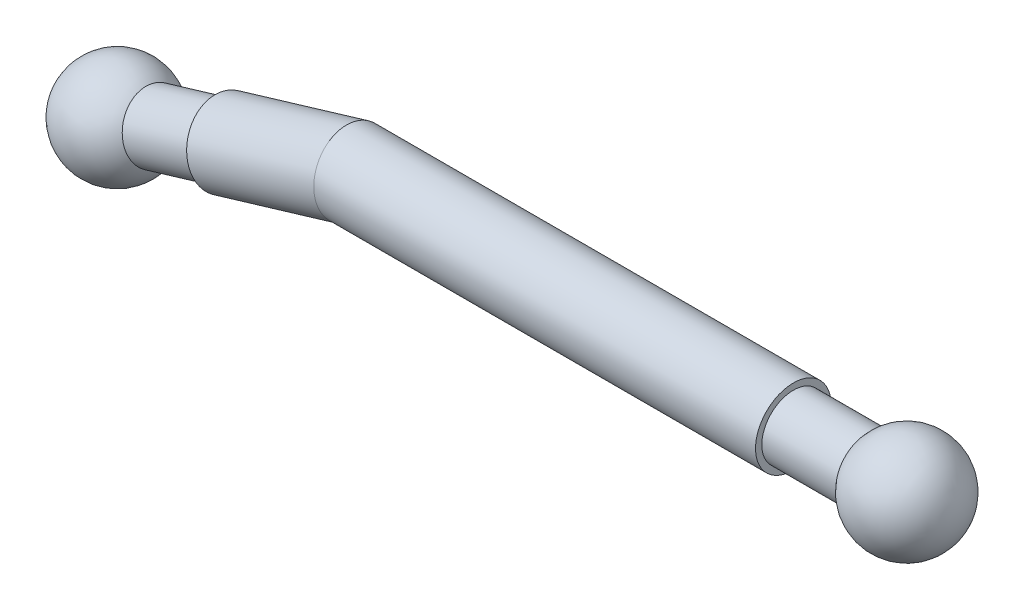
ISO-10303-21;
HEADER;
FILE_DESCRIPTION(('STEP AP214'),'2;1');
FILE_NAME('part.step','',(''),(''),'','','');
FILE_SCHEMA(('AUTOMOTIVE_DESIGN { 1 0 10303 214 1 1 1 1 }'));
ENDSEC;
DATA;
#1=APPLICATION_CONTEXT('core data for automotive mechanical design processes');
#2=APPLICATION_PROTOCOL_DEFINITION('international standard','automotive_design',2000,#1);
#3=PRODUCT_CONTEXT('',#1,'mechanical');
#4=PRODUCT('Part','Part','',(#3));
#5=PRODUCT_RELATED_PRODUCT_CATEGORY('part','',(#4));
#6=PRODUCT_DEFINITION_FORMATION('','',#4);
#7=PRODUCT_DEFINITION_CONTEXT('part definition',#1,'design');
#8=PRODUCT_DEFINITION('design','',#6,#7);
#9=PRODUCT_DEFINITION_SHAPE('','',#8);
#10=(LENGTH_UNIT() NAMED_UNIT(*) SI_UNIT(.MILLI.,.METRE.));
#11=(NAMED_UNIT(*) PLANE_ANGLE_UNIT() SI_UNIT($,.RADIAN.));
#12=(NAMED_UNIT(*) SI_UNIT($,.STERADIAN.) SOLID_ANGLE_UNIT());
#13=UNCERTAINTY_MEASURE_WITH_UNIT(LENGTH_MEASURE(1.E-05),#10,'distance_accuracy_value','');
#14=(GEOMETRIC_REPRESENTATION_CONTEXT(3) GLOBAL_UNCERTAINTY_ASSIGNED_CONTEXT((#13)) GLOBAL_UNIT_ASSIGNED_CONTEXT((#10,
#11,#12)) REPRESENTATION_CONTEXT('',''));
#15=CARTESIAN_POINT('',(0.,0.,0.));
#16=DIRECTION('',(0.,0.,1.));
#17=DIRECTION('',(1.,0.,0.));
#18=AXIS2_PLACEMENT_3D('',#15,#16,#17);
#19=CARTESIAN_POINT('',(6.,0.,0.));
#20=DIRECTION('',(-1.,0.,0.));
#21=DIRECTION('',(0.,0.,1.));
#22=AXIS2_PLACEMENT_3D('',#19,#20,#21);
#23=CYLINDRICAL_SURFACE('',#22,2.5);
#24=CARTESIAN_POINT('',(0.,0.,0.));
#25=DIRECTION('',(1.,0.,0.));
#26=DIRECTION('',(0.,0.,-1.));
#27=AXIS2_PLACEMENT_3D('',#24,#25,#26);
#28=CIRCLE('',#27,2.5);
#29=CARTESIAN_POINT('',(0.,0.,-2.5));
#30=VERTEX_POINT('',#29);
#31=EDGE_CURVE('E41',#30,#30,#28,.T.);
#32=ORIENTED_EDGE('',*,*,#31,.T.);
#33=EDGE_LOOP('',(#32));
#34=FACE_BOUND('',#33,.T.);
#35=CARTESIAN_POINT('',(5.8775010008008,0.,0.));
#36=DIRECTION('',(1.,0.,0.));
#37=DIRECTION('',(0.,0.,-1.));
#38=AXIS2_PLACEMENT_3D('',#35,#36,#37);
#39=CIRCLE('',#38,2.5);
#40=CARTESIAN_POINT('',(5.8775010008008,0.,-2.5));
#41=VERTEX_POINT('',#40);
#42=EDGE_CURVE('E11',#41,#41,#39,.T.);
#43=ORIENTED_EDGE('',*,*,#42,.F.);
#44=EDGE_LOOP('',(#43));
#45=FACE_BOUND('',#44,.T.);
#46=ADVANCED_FACE('F33',(#34,#45),#23,.T.);
#47=CARTESIAN_POINT('',(-50.7469577113269,-4.72408731339807,0.));
#48=DIRECTION('',(0.957826285221151,0.287347885566345,0.));
#49=DIRECTION('',(-0.287347885566345,0.957826285221152,0.));
#50=AXIS2_PLACEMENT_3D('',#47,#48,#49);
#51=CYLINDRICAL_SURFACE('',#50,2.5);
#52=CARTESIAN_POINT('',(-45.,-3.,0.));
#53=DIRECTION('',(-0.957826285221152,-0.287347885566345,0.));
#54=DIRECTION('',(0.287347885566345,-0.957826285221152,0.));
#55=AXIS2_PLACEMENT_3D('',#52,#53,#54);
#56=CIRCLE('',#55,2.5);
#57=CARTESIAN_POINT('',(-44.2816302860841,-5.39456571305288,0.));
#58=VERTEX_POINT('',#57);
#59=EDGE_CURVE('E59',#58,#58,#56,.T.);
#60=ORIENTED_EDGE('',*,*,#59,.T.);
#61=EDGE_LOOP('',(#60));
#62=FACE_BOUND('',#61,.T.);
#63=CARTESIAN_POINT('',(-50.6296249499807,-4.6888874849942,0.));
#64=DIRECTION('',(-0.957826285221151,-0.287347885566345,0.));
#65=DIRECTION('',(0.287347885566345,-0.957826285221152,0.));
#66=AXIS2_PLACEMENT_3D('',#63,#64,#65);
#67=CIRCLE('',#66,2.5);
#68=CARTESIAN_POINT('',(-49.9112552360648,-7.08345319804708,0.));
#69=VERTEX_POINT('',#68);
#70=EDGE_CURVE('E62',#69,#69,#67,.T.);
#71=ORIENTED_EDGE('',*,*,#70,.F.);
#72=EDGE_LOOP('',(#71));
#73=FACE_BOUND('',#72,.T.);
#74=ADVANCED_FACE('F84',(#62,#73),#51,.T.);
#75=CARTESIAN_POINT('',(-45.,-3.,0.));
#76=DIRECTION('',(0.957826285221151,0.287347885566345,0.));
#77=DIRECTION('',(0.,0.,-1.));
#78=AXIS2_PLACEMENT_3D('',#75,#76,#77);
#79=PLANE('',#78);
#80=ORIENTED_EDGE('',*,*,#59,.F.);
#81=EDGE_LOOP('',(#80));
#82=FACE_BOUND('',#81,.T.);
#83=CARTESIAN_POINT('',(-45.,-3.,0.));
#84=DIRECTION('',(0.957826285221151,0.287347885566345,0.));
#85=DIRECTION('',(0.,0.,-1.));
#86=AXIS2_PLACEMENT_3D('',#83,#84,#85);
#87=CIRCLE('',#86,3.);
#88=CARTESIAN_POINT('',(-45.,-3.,-3.));
#89=VERTEX_POINT('',#88);
#90=EDGE_CURVE('E46',#89,#89,#87,.T.);
#91=ORIENTED_EDGE('',*,*,#90,.F.);
#92=EDGE_LOOP('',(#91));
#93=FACE_BOUND('',#92,.T.);
#94=ADVANCED_FACE('F35',(#82,#93),#79,.F.);
#95=CARTESIAN_POINT('',(0.,0.,0.));
#96=DIRECTION('',(1.,0.,0.));
#97=DIRECTION('',(0.,0.,-1.));
#98=AXIS2_PLACEMENT_3D('',#95,#96,#97);
#99=PLANE('',#98);
#100=ORIENTED_EDGE('',*,*,#31,.F.);
#101=EDGE_LOOP('',(#100));
#102=FACE_BOUND('',#101,.T.);
#103=CARTESIAN_POINT('',(0.,0.,0.));
#104=DIRECTION('',(1.,0.,0.));
#105=DIRECTION('',(0.,0.,-1.));
#106=AXIS2_PLACEMENT_3D('',#103,#104,#105);
#107=CIRCLE('',#106,3.);
#108=CARTESIAN_POINT('',(0.,0.,-3.));
#109=VERTEX_POINT('',#108);
#110=EDGE_CURVE('E51',#109,#109,#107,.T.);
#111=ORIENTED_EDGE('',*,*,#110,.T.);
#112=EDGE_LOOP('',(#111));
#113=FACE_BOUND('',#112,.T.);
#114=ADVANCED_FACE('F75',(#102,#113),#99,.T.);
#115=CARTESIAN_POINT('',(-33.9763956463432,0.307081306097031,0.));
#116=DIRECTION('',(-0.957826285221151,-0.287347885566345,0.));
#117=DIRECTION('',(0.287347885566345,-0.957826285221151,0.));
#118=AXIS2_PLACEMENT_3D('',#115,#116,#117);
#119=CYLINDRICAL_SURFACE('',#118,3.);
#120=CARTESIAN_POINT('',(-35.,0.,0.));
#121=DIRECTION('',(-0.989400395497483,-0.145213144685405,0.));
#122=DIRECTION('',(-0.145213144685405,0.989400395497483,0.));
#123=AXIS2_PLACEMENT_3D('',#120,#121,#122);
#124=ELLIPSE('',#123,3.0321394792768,3.);
#125=CARTESIAN_POINT('',(-35.4403065089106,3.,0.));
#126=VERTEX_POINT('',#125);
#127=EDGE_CURVE('E56',#126,#126,#124,.T.);
#128=ORIENTED_EDGE('',*,*,#127,.T.);
#129=EDGE_LOOP('',(#128));
#130=FACE_BOUND('',#129,.T.);
#131=ORIENTED_EDGE('',*,*,#90,.T.);
#132=EDGE_LOOP('',(#131));
#133=FACE_BOUND('',#132,.T.);
#134=ADVANCED_FACE('F78',(#130,#133),#119,.T.);
#135=CARTESIAN_POINT('',(0.,0.,0.));
#136=DIRECTION('',(-1.,0.,0.));
#137=DIRECTION('',(0.,-1.,0.));
#138=AXIS2_PLACEMENT_3D('',#135,#136,#137);
#139=CYLINDRICAL_SURFACE('',#138,3.);
#140=ORIENTED_EDGE('',*,*,#110,.F.);
#141=EDGE_LOOP('',(#140));
#142=FACE_BOUND('',#141,.T.);
#143=ORIENTED_EDGE('',*,*,#127,.F.);
#144=EDGE_LOOP('',(#143));
#145=FACE_BOUND('',#144,.T.);
#146=ADVANCED_FACE('F57',(#142,#145),#139,.T.);
#147=CARTESIAN_POINT('',(-53.6204365669904,-5.58613097009712,0.));
#148=DIRECTION('',(-0.287347885566345,0.957826285221152,0.));
#149=DIRECTION('',(0.,0.,1.));
#150=AXIS2_PLACEMENT_3D('',#147,#148,#149);
#151=SPHERICAL_SURFACE('',#150,4.);
#152=CARTESIAN_POINT('',(-53.6204365669904,-5.58613097009712,0.));
#153=DIRECTION('',(-0.957826285221152,-0.287347885566345,0.));
#154=DIRECTION('',(0.287347885566345,-0.957826285221151,0.));
#155=AXIS2_PLACEMENT_3D('',#152,#153,#154);
#156=SPHERICAL_SURFACE('',#155,4.);
#157=ORIENTED_EDGE('',*,*,#70,.T.);
#158=EDGE_LOOP('',(#157));
#159=FACE_BOUND('',#158,.T.);
#160=ADVANCED_FACE('F86',(#159),#156,.T.);
#161=CARTESIAN_POINT('',(9.,0.,0.));
#162=DIRECTION('',(0.,1.,0.));
#163=DIRECTION('',(0.,0.,1.));
#164=AXIS2_PLACEMENT_3D('',#161,#162,#163);
#165=SPHERICAL_SURFACE('',#164,4.);
#166=CARTESIAN_POINT('',(9.,0.,0.));
#167=DIRECTION('',(1.,0.,0.));
#168=DIRECTION('',(0.,0.,-1.));
#169=AXIS2_PLACEMENT_3D('',#166,#167,#168);
#170=SPHERICAL_SURFACE('',#169,4.);
#171=ORIENTED_EDGE('',*,*,#42,.T.);
#172=EDGE_LOOP('',(#171));
#173=FACE_BOUND('',#172,.T.);
#174=ADVANCED_FACE('F96',(#173),#170,.T.);
#175=CLOSED_SHELL('',(#46,#74,#94,#114,#134,#146,#160,#174));
#176=MANIFOLD_SOLID_BREP('B2',#175);
#177=ADVANCED_BREP_SHAPE_REPRESENTATION('',(#18,#176),#14);
#178=SHAPE_DEFINITION_REPRESENTATION(#9,#177);
ENDSEC;
END-ISO-10303-21;
